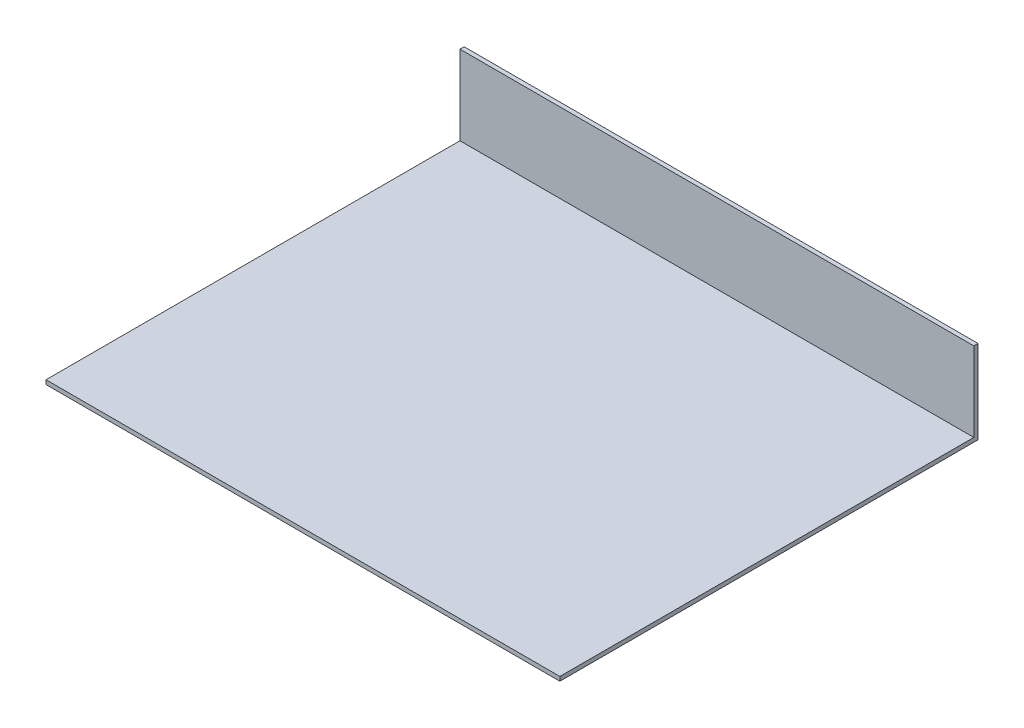
ISO-10303-21;
HEADER;
FILE_DESCRIPTION(('STEP AP214'),'2;1');
FILE_NAME('part.step','',(''),(''),'','','');
FILE_SCHEMA(('AUTOMOTIVE_DESIGN { 1 0 10303 214 1 1 1 1 }'));
ENDSEC;
DATA;
#1=APPLICATION_CONTEXT('core data for automotive mechanical design processes');
#2=APPLICATION_PROTOCOL_DEFINITION('international standard','automotive_design',2000,#1);
#3=PRODUCT_CONTEXT('',#1,'mechanical');
#4=PRODUCT('Part','Part','',(#3));
#5=PRODUCT_RELATED_PRODUCT_CATEGORY('part','',(#4));
#6=PRODUCT_DEFINITION_FORMATION('','',#4);
#7=PRODUCT_DEFINITION_CONTEXT('part definition',#1,'design');
#8=PRODUCT_DEFINITION('design','',#6,#7);
#9=PRODUCT_DEFINITION_SHAPE('','',#8);
#10=(LENGTH_UNIT() NAMED_UNIT(*) SI_UNIT(.MILLI.,.METRE.));
#11=(NAMED_UNIT(*) PLANE_ANGLE_UNIT() SI_UNIT($,.RADIAN.));
#12=(NAMED_UNIT(*) SI_UNIT($,.STERADIAN.) SOLID_ANGLE_UNIT());
#13=UNCERTAINTY_MEASURE_WITH_UNIT(LENGTH_MEASURE(1.E-05),#10,'distance_accuracy_value','');
#14=(GEOMETRIC_REPRESENTATION_CONTEXT(3) GLOBAL_UNCERTAINTY_ASSIGNED_CONTEXT((#13)) GLOBAL_UNIT_ASSIGNED_CONTEXT((#10,
#11,#12)) REPRESENTATION_CONTEXT('',''));
#15=CARTESIAN_POINT('',(0.,0.,0.));
#16=DIRECTION('',(0.,0.,1.));
#17=DIRECTION('',(1.,0.,0.));
#18=AXIS2_PLACEMENT_3D('',#15,#16,#17);
#19=CARTESIAN_POINT('',(184.345,3.,-150.));
#20=DIRECTION('',(-1.,0.,0.));
#21=DIRECTION('',(0.,0.,1.));
#22=AXIS2_PLACEMENT_3D('',#19,#20,#21);
#23=PLANE('',#22);
#24=DIRECTION('',(0.,0.,-1.));
#25=VECTOR('',#24,1.);
#26=CARTESIAN_POINT('',(184.345,0.,-150.));
#27=LINE('',#26,#25);
#28=CARTESIAN_POINT('',(184.345,0.,150.));
#29=VERTEX_POINT('',#28);
#30=CARTESIAN_POINT('',(184.345,0.,-150.));
#31=VERTEX_POINT('',#30);
#32=EDGE_CURVE('E104',#29,#31,#27,.T.);
#33=ORIENTED_EDGE('',*,*,#32,.T.);
#34=DIRECTION('',(0.,-1.,0.));
#35=VECTOR('',#34,1.);
#36=CARTESIAN_POINT('',(184.345,3.,-150.));
#37=LINE('',#36,#35);
#38=CARTESIAN_POINT('',(184.345,59.91,-150.));
#39=VERTEX_POINT('',#38);
#40=EDGE_CURVE('E11',#39,#31,#37,.T.);
#41=ORIENTED_EDGE('',*,*,#40,.F.);
#42=DIRECTION('',(0.,0.,-1.));
#43=VECTOR('',#42,1.);
#44=CARTESIAN_POINT('',(184.345,59.91,-150.));
#45=LINE('',#44,#43);
#46=CARTESIAN_POINT('',(184.345,59.91,-147.));
#47=VERTEX_POINT('',#46);
#48=EDGE_CURVE('E147',#47,#39,#45,.T.);
#49=ORIENTED_EDGE('',*,*,#48,.F.);
#50=DIRECTION('',(0.,-1.,0.));
#51=VECTOR('',#50,1.);
#52=CARTESIAN_POINT('',(184.345,59.91,-147.));
#53=LINE('',#52,#51);
#54=CARTESIAN_POINT('',(184.345,3.,-147.));
#55=VERTEX_POINT('',#54);
#56=EDGE_CURVE('E117',#47,#55,#53,.T.);
#57=ORIENTED_EDGE('',*,*,#56,.T.);
#58=DIRECTION('',(0.,0.,-1.));
#59=VECTOR('',#58,1.);
#60=CARTESIAN_POINT('',(184.345,3.,-150.));
#61=LINE('',#60,#59);
#62=CARTESIAN_POINT('',(184.345,3.,150.));
#63=VERTEX_POINT('',#62);
#64=EDGE_CURVE('E98',#63,#55,#61,.T.);
#65=ORIENTED_EDGE('',*,*,#64,.F.);
#66=DIRECTION('',(0.,-1.,0.));
#67=VECTOR('',#66,1.);
#68=CARTESIAN_POINT('',(184.345,3.,150.));
#69=LINE('',#68,#67);
#70=EDGE_CURVE('E90',#63,#29,#69,.T.);
#71=ORIENTED_EDGE('',*,*,#70,.T.);
#72=EDGE_LOOP('',(#33,#41,#49,#57,#65,#71));
#73=FACE_BOUND('',#72,.T.);
#74=ADVANCED_FACE('F47',(#73),#23,.F.);
#75=CARTESIAN_POINT('',(-184.345,3.,-150.));
#76=DIRECTION('',(0.,0.,1.));
#77=DIRECTION('',(1.,0.,0.));
#78=AXIS2_PLACEMENT_3D('',#75,#76,#77);
#79=PLANE('',#78);
#80=DIRECTION('',(-1.,0.,0.));
#81=VECTOR('',#80,1.);
#82=CARTESIAN_POINT('',(-184.345,0.,-150.));
#83=LINE('',#82,#81);
#84=CARTESIAN_POINT('',(-184.345,0.,-150.));
#85=VERTEX_POINT('',#84);
#86=EDGE_CURVE('E109',#31,#85,#83,.T.);
#87=ORIENTED_EDGE('',*,*,#86,.T.);
#88=DIRECTION('',(0.,-1.,0.));
#89=VECTOR('',#88,1.);
#90=CARTESIAN_POINT('',(-184.345,3.,-150.));
#91=LINE('',#90,#89);
#92=CARTESIAN_POINT('',(-184.345,59.91,-150.));
#93=VERTEX_POINT('',#92);
#94=EDGE_CURVE('E55',#93,#85,#91,.T.);
#95=ORIENTED_EDGE('',*,*,#94,.F.);
#96=DIRECTION('',(-1.,0.,0.));
#97=VECTOR('',#96,1.);
#98=CARTESIAN_POINT('',(-184.345,59.91,-150.));
#99=LINE('',#98,#97);
#100=EDGE_CURVE('E139',#39,#93,#99,.T.);
#101=ORIENTED_EDGE('',*,*,#100,.F.);
#102=ORIENTED_EDGE('',*,*,#40,.T.);
#103=EDGE_LOOP('',(#87,#95,#101,#102));
#104=FACE_BOUND('',#103,.T.);
#105=ADVANCED_FACE('F137',(#104),#79,.F.);
#106=CARTESIAN_POINT('',(-184.345,3.,-150.));
#107=DIRECTION('',(1.,0.,0.));
#108=DIRECTION('',(0.,0.,-1.));
#109=AXIS2_PLACEMENT_3D('',#106,#107,#108);
#110=PLANE('',#109);
#111=DIRECTION('',(0.,0.,1.));
#112=VECTOR('',#111,1.);
#113=CARTESIAN_POINT('',(-184.345,0.,-150.));
#114=LINE('',#113,#112);
#115=CARTESIAN_POINT('',(-184.345,0.,150.));
#116=VERTEX_POINT('',#115);
#117=EDGE_CURVE('E99',#85,#116,#114,.T.);
#118=ORIENTED_EDGE('',*,*,#117,.T.);
#119=DIRECTION('',(0.,-1.,0.));
#120=VECTOR('',#119,1.);
#121=CARTESIAN_POINT('',(-184.345,3.,150.));
#122=LINE('',#121,#120);
#123=CARTESIAN_POINT('',(-184.345,3.,150.));
#124=VERTEX_POINT('',#123);
#125=EDGE_CURVE('E93',#124,#116,#122,.T.);
#126=ORIENTED_EDGE('',*,*,#125,.F.);
#127=DIRECTION('',(0.,0.,1.));
#128=VECTOR('',#127,1.);
#129=CARTESIAN_POINT('',(-184.345,3.,-150.));
#130=LINE('',#129,#128);
#131=CARTESIAN_POINT('',(-184.345,3.,-147.));
#132=VERTEX_POINT('',#131);
#133=EDGE_CURVE('E160',#132,#124,#130,.T.);
#134=ORIENTED_EDGE('',*,*,#133,.F.);
#135=DIRECTION('',(0.,-1.,0.));
#136=VECTOR('',#135,1.);
#137=CARTESIAN_POINT('',(-184.345,59.91,-147.));
#138=LINE('',#137,#136);
#139=CARTESIAN_POINT('',(-184.345,59.91,-147.));
#140=VERTEX_POINT('',#139);
#141=EDGE_CURVE('E111',#140,#132,#138,.T.);
#142=ORIENTED_EDGE('',*,*,#141,.F.);
#143=DIRECTION('',(0.,0.,1.));
#144=VECTOR('',#143,1.);
#145=CARTESIAN_POINT('',(-184.345,59.91,-150.));
#146=LINE('',#145,#144);
#147=EDGE_CURVE('E133',#93,#140,#146,.T.);
#148=ORIENTED_EDGE('',*,*,#147,.F.);
#149=ORIENTED_EDGE('',*,*,#94,.T.);
#150=EDGE_LOOP('',(#118,#126,#134,#142,#148,#149));
#151=FACE_BOUND('',#150,.T.);
#152=ADVANCED_FACE('F130',(#151),#110,.F.);
#153=CARTESIAN_POINT('',(-184.345,3.,150.));
#154=DIRECTION('',(0.,0.,-1.));
#155=DIRECTION('',(-1.,0.,0.));
#156=AXIS2_PLACEMENT_3D('',#153,#154,#155);
#157=PLANE('',#156);
#158=DIRECTION('',(1.,0.,0.));
#159=VECTOR('',#158,1.);
#160=CARTESIAN_POINT('',(-184.345,0.,150.));
#161=LINE('',#160,#159);
#162=EDGE_CURVE('E87',#116,#29,#161,.T.);
#163=ORIENTED_EDGE('',*,*,#162,.T.);
#164=ORIENTED_EDGE('',*,*,#70,.F.);
#165=DIRECTION('',(1.,0.,0.));
#166=VECTOR('',#165,1.);
#167=CARTESIAN_POINT('',(-184.345,3.,150.));
#168=LINE('',#167,#166);
#169=EDGE_CURVE('E68',#124,#63,#168,.T.);
#170=ORIENTED_EDGE('',*,*,#169,.F.);
#171=ORIENTED_EDGE('',*,*,#125,.T.);
#172=EDGE_LOOP('',(#163,#164,#170,#171));
#173=FACE_BOUND('',#172,.T.);
#174=ADVANCED_FACE('F89',(#173),#157,.F.);
#175=CARTESIAN_POINT('',(0.,3.,0.));
#176=DIRECTION('',(0.,1.,0.));
#177=DIRECTION('',(0.,0.,1.));
#178=AXIS2_PLACEMENT_3D('',#175,#176,#177);
#179=PLANE('',#178);
#180=DIRECTION('',(1.,0.,0.));
#181=VECTOR('',#180,1.);
#182=CARTESIAN_POINT('',(-184.345,3.,-147.));
#183=LINE('',#182,#181);
#184=EDGE_CURVE('E62',#132,#55,#183,.T.);
#185=ORIENTED_EDGE('',*,*,#184,.F.);
#186=ORIENTED_EDGE('',*,*,#133,.T.);
#187=ORIENTED_EDGE('',*,*,#169,.T.);
#188=ORIENTED_EDGE('',*,*,#64,.T.);
#189=EDGE_LOOP('',(#185,#186,#187,#188));
#190=FACE_BOUND('',#189,.T.);
#191=ADVANCED_FACE('F169',(#190),#179,.T.);
#192=CARTESIAN_POINT('',(0.,0.,0.));
#193=DIRECTION('',(0.,1.,0.));
#194=DIRECTION('',(0.,0.,1.));
#195=AXIS2_PLACEMENT_3D('',#192,#193,#194);
#196=PLANE('',#195);
#197=ORIENTED_EDGE('',*,*,#32,.F.);
#198=ORIENTED_EDGE('',*,*,#162,.F.);
#199=ORIENTED_EDGE('',*,*,#117,.F.);
#200=ORIENTED_EDGE('',*,*,#86,.F.);
#201=EDGE_LOOP('',(#197,#198,#199,#200));
#202=FACE_BOUND('',#201,.T.);
#203=ADVANCED_FACE('F108',(#202),#196,.F.);
#204=CARTESIAN_POINT('',(-184.345,59.91,-147.));
#205=DIRECTION('',(0.,0.,-1.));
#206=DIRECTION('',(-1.,0.,0.));
#207=AXIS2_PLACEMENT_3D('',#204,#205,#206);
#208=PLANE('',#207);
#209=ORIENTED_EDGE('',*,*,#184,.T.);
#210=ORIENTED_EDGE('',*,*,#56,.F.);
#211=DIRECTION('',(1.,0.,0.));
#212=VECTOR('',#211,1.);
#213=CARTESIAN_POINT('',(-184.345,59.91,-147.));
#214=LINE('',#213,#212);
#215=EDGE_CURVE('E153',#140,#47,#214,.T.);
#216=ORIENTED_EDGE('',*,*,#215,.F.);
#217=ORIENTED_EDGE('',*,*,#141,.T.);
#218=EDGE_LOOP('',(#209,#210,#216,#217));
#219=FACE_BOUND('',#218,.T.);
#220=ADVANCED_FACE('F172',(#219),#208,.F.);
#221=CARTESIAN_POINT('',(0.,59.91,0.));
#222=DIRECTION('',(0.,1.,0.));
#223=DIRECTION('',(0.,0.,1.));
#224=AXIS2_PLACEMENT_3D('',#221,#222,#223);
#225=PLANE('',#224);
#226=ORIENTED_EDGE('',*,*,#147,.T.);
#227=ORIENTED_EDGE('',*,*,#215,.T.);
#228=ORIENTED_EDGE('',*,*,#48,.T.);
#229=ORIENTED_EDGE('',*,*,#100,.T.);
#230=EDGE_LOOP('',(#226,#227,#228,#229));
#231=FACE_BOUND('',#230,.T.);
#232=ADVANCED_FACE('F143',(#231),#225,.T.);
#233=CLOSED_SHELL('',(#74,#105,#152,#174,#191,#203,#220,#232));
#234=MANIFOLD_SOLID_BREP('B2',#233);
#235=ADVANCED_BREP_SHAPE_REPRESENTATION('',(#18,#234),#14);
#236=SHAPE_DEFINITION_REPRESENTATION(#9,#235);
ENDSEC;
END-ISO-10303-21;
